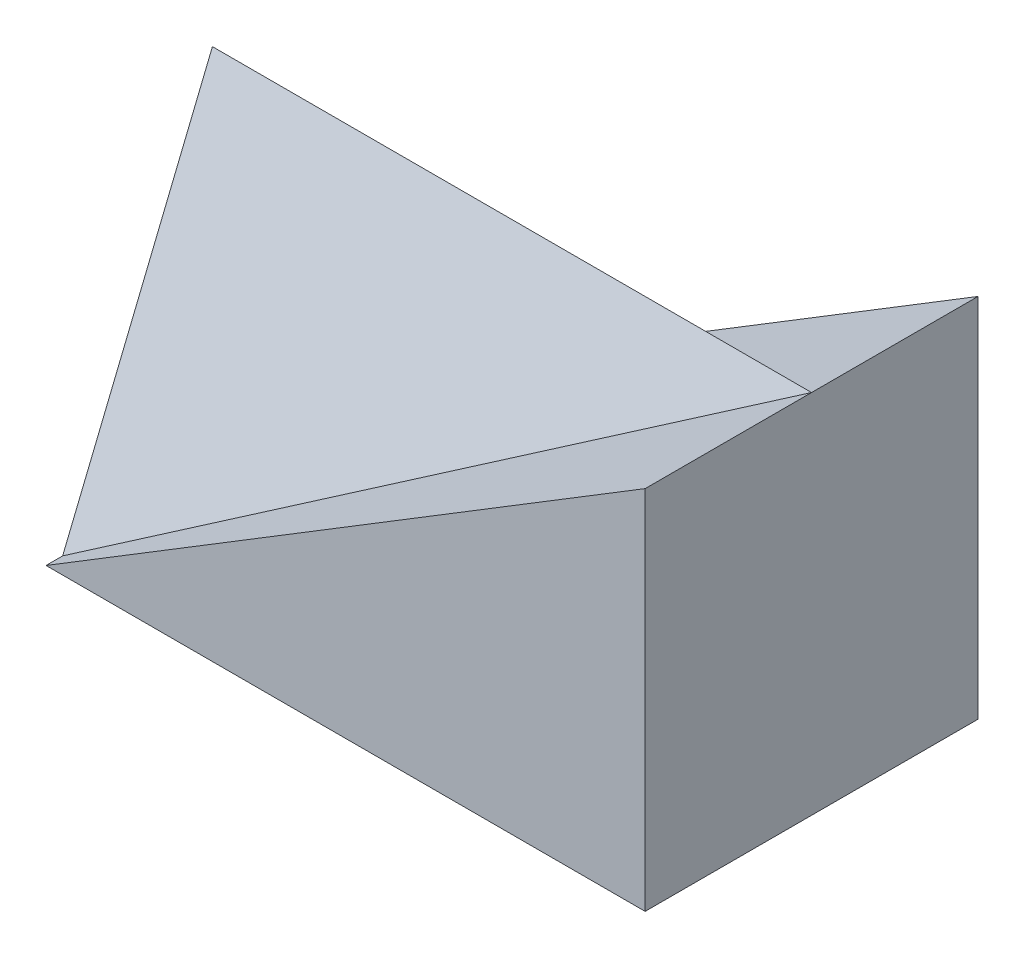
ISO-10303-21;
HEADER;
FILE_DESCRIPTION(('STEP AP214'),'2;1');
FILE_NAME('part.step','',(''),(''),'','','');
FILE_SCHEMA(('AUTOMOTIVE_DESIGN { 1 0 10303 214 1 1 1 1 }'));
ENDSEC;
DATA;
#1=APPLICATION_CONTEXT('core data for automotive mechanical design processes');
#2=APPLICATION_PROTOCOL_DEFINITION('international standard','automotive_design',2000,#1);
#3=PRODUCT_CONTEXT('',#1,'mechanical');
#4=PRODUCT('Part','Part','',(#3));
#5=PRODUCT_RELATED_PRODUCT_CATEGORY('part','',(#4));
#6=PRODUCT_DEFINITION_FORMATION('','',#4);
#7=PRODUCT_DEFINITION_CONTEXT('part definition',#1,'design');
#8=PRODUCT_DEFINITION('design','',#6,#7);
#9=PRODUCT_DEFINITION_SHAPE('','',#8);
#10=(LENGTH_UNIT() NAMED_UNIT(*) SI_UNIT(.MILLI.,.METRE.));
#11=(NAMED_UNIT(*) PLANE_ANGLE_UNIT() SI_UNIT($,.RADIAN.));
#12=(NAMED_UNIT(*) SI_UNIT($,.STERADIAN.) SOLID_ANGLE_UNIT());
#13=UNCERTAINTY_MEASURE_WITH_UNIT(LENGTH_MEASURE(1.E-05),#10,'distance_accuracy_value','');
#14=(GEOMETRIC_REPRESENTATION_CONTEXT(3) GLOBAL_UNCERTAINTY_ASSIGNED_CONTEXT((#13)) GLOBAL_UNIT_ASSIGNED_CONTEXT((#10,
#11,#12)) REPRESENTATION_CONTEXT('',''));
#15=CARTESIAN_POINT('',(0.,0.,0.));
#16=DIRECTION('',(0.,0.,1.));
#17=DIRECTION('',(1.,0.,0.));
#18=AXIS2_PLACEMENT_3D('',#15,#16,#17);
#19=CARTESIAN_POINT('',(36000.,22000.,20000.));
#20=DIRECTION('',(0.521450009453975,-0.853281833651959,0.));
#21=DIRECTION('',(0.853281833651959,0.521450009453975,0.));
#22=AXIS2_PLACEMENT_3D('',#19,#20,#21);
#23=PLANE('',#22);
#24=DIRECTION('',(0.,0.,-1.));
#25=VECTOR('',#24,1.);
#26=CARTESIAN_POINT('',(0.,0.,20000.));
#27=LINE('',#26,#25);
#28=CARTESIAN_POINT('',(0.,0.,1000.));
#29=VERTEX_POINT('',#28);
#30=CARTESIAN_POINT('',(0.,0.,0.));
#31=VERTEX_POINT('',#30);
#32=EDGE_CURVE('E41',#29,#31,#27,.T.);
#33=ORIENTED_EDGE('',*,*,#32,.F.);
#34=DIRECTION('',(0.834505713019267,0.509975713511774,0.208626428254817));
#35=VECTOR('',#34,1.);
#36=CARTESIAN_POINT('',(37740.9994626545,23063.9441160666,10435.2498656636));
#37=LINE('',#36,#35);
#38=CARTESIAN_POINT('',(36000.,22000.,10000.));
#39=VERTEX_POINT('',#38);
#40=EDGE_CURVE('E103',#29,#39,#37,.T.);
#41=ORIENTED_EDGE('',*,*,#40,.T.);
#42=DIRECTION('',(0.,0.,-1.));
#43=VECTOR('',#42,1.);
#44=CARTESIAN_POINT('',(36000.,22000.,20000.));
#45=LINE('',#44,#43);
#46=CARTESIAN_POINT('',(36000.,22000.,0.));
#47=VERTEX_POINT('',#46);
#48=EDGE_CURVE('E75',#39,#47,#45,.T.);
#49=ORIENTED_EDGE('',*,*,#48,.T.);
#50=DIRECTION('',(-0.853281833651959,-0.521450009453975,0.));
#51=VECTOR('',#50,1.);
#52=CARTESIAN_POINT('',(36000.,22000.,0.));
#53=LINE('',#52,#51);
#54=EDGE_CURVE('E110',#47,#31,#53,.T.);
#55=ORIENTED_EDGE('',*,*,#54,.T.);
#56=EDGE_LOOP('',(#33,#41,#49,#55));
#57=FACE_BOUND('',#56,.T.);
#58=ADVANCED_FACE('F33',(#57),#23,.F.);
#59=CARTESIAN_POINT('',(36000.,22000.,20000.));
#60=VERTEX_POINT('',#59);
#61=EDGE_CURVE('E121',#60,#39,#45,.T.);
#62=ORIENTED_EDGE('',*,*,#61,.T.);
#63=DIRECTION('',(-0.834505713019267,-0.509975713511774,0.208626428254817));
#64=VECTOR('',#63,1.);
#65=CARTESIAN_POINT('',(34259.0005373455,20936.0558839334,10435.2498656636));
#66=LINE('',#65,#64);
#67=CARTESIAN_POINT('',(0.,0.,19000.));
#68=VERTEX_POINT('',#67);
#69=EDGE_CURVE('E95',#39,#68,#66,.T.);
#70=ORIENTED_EDGE('',*,*,#69,.T.);
#71=CARTESIAN_POINT('',(0.,0.,20000.));
#72=VERTEX_POINT('',#71);
#73=EDGE_CURVE('E11',#72,#68,#27,.T.);
#74=ORIENTED_EDGE('',*,*,#73,.F.);
#75=DIRECTION('',(-0.853281833651959,-0.521450009453975,0.));
#76=VECTOR('',#75,1.);
#77=CARTESIAN_POINT('',(36000.,22000.,20000.));
#78=LINE('',#77,#76);
#79=EDGE_CURVE('E111',#60,#72,#78,.T.);
#80=ORIENTED_EDGE('',*,*,#79,.F.);
#81=EDGE_LOOP('',(#62,#70,#74,#80));
#82=FACE_BOUND('',#81,.T.);
#83=ADVANCED_FACE('F35',(#82),#23,.F.);
#84=CARTESIAN_POINT('',(0.,0.,20000.));
#85=DIRECTION('',(0.,1.,0.));
#86=DIRECTION('',(0.,0.,1.));
#87=AXIS2_PLACEMENT_3D('',#84,#85,#86);
#88=PLANE('',#87);
#89=ORIENTED_EDGE('',*,*,#73,.T.);
#90=DIRECTION('',(0.,0.,-1.));
#91=VECTOR('',#90,1.);
#92=CARTESIAN_POINT('',(0.,0.,19000.));
#93=LINE('',#92,#91);
#94=EDGE_CURVE('E97',#68,#29,#93,.T.);
#95=ORIENTED_EDGE('',*,*,#94,.T.);
#96=ORIENTED_EDGE('',*,*,#32,.T.);
#97=DIRECTION('',(1.,0.,0.));
#98=VECTOR('',#97,1.);
#99=CARTESIAN_POINT('',(0.,0.,0.));
#100=LINE('',#99,#98);
#101=CARTESIAN_POINT('',(36000.,0.,0.));
#102=VERTEX_POINT('',#101);
#103=EDGE_CURVE('E117',#31,#102,#100,.T.);
#104=ORIENTED_EDGE('',*,*,#103,.T.);
#105=DIRECTION('',(0.,0.,-1.));
#106=VECTOR('',#105,1.);
#107=CARTESIAN_POINT('',(36000.,0.,20000.));
#108=LINE('',#107,#106);
#109=CARTESIAN_POINT('',(36000.,0.,20000.));
#110=VERTEX_POINT('',#109);
#111=EDGE_CURVE('E123',#110,#102,#108,.T.);
#112=ORIENTED_EDGE('',*,*,#111,.F.);
#113=DIRECTION('',(1.,0.,0.));
#114=VECTOR('',#113,1.);
#115=CARTESIAN_POINT('',(0.,0.,20000.));
#116=LINE('',#115,#114);
#117=EDGE_CURVE('E80',#72,#110,#116,.T.);
#118=ORIENTED_EDGE('',*,*,#117,.F.);
#119=EDGE_LOOP('',(#89,#95,#96,#104,#112,#118));
#120=FACE_BOUND('',#119,.T.);
#121=ADVANCED_FACE('F126',(#120),#88,.F.);
#122=CARTESIAN_POINT('',(36000.,0.,20000.));
#123=DIRECTION('',(-1.,0.,0.));
#124=DIRECTION('',(0.,0.,1.));
#125=AXIS2_PLACEMENT_3D('',#122,#123,#124);
#126=PLANE('',#125);
#127=ORIENTED_EDGE('',*,*,#111,.T.);
#128=DIRECTION('',(0.,1.,0.));
#129=VECTOR('',#128,1.);
#130=CARTESIAN_POINT('',(36000.,0.,0.));
#131=LINE('',#130,#129);
#132=EDGE_CURVE('E113',#102,#47,#131,.T.);
#133=ORIENTED_EDGE('',*,*,#132,.T.);
#134=ORIENTED_EDGE('',*,*,#48,.F.);
#135=ORIENTED_EDGE('',*,*,#61,.F.);
#136=DIRECTION('',(0.,1.,0.));
#137=VECTOR('',#136,1.);
#138=CARTESIAN_POINT('',(36000.,0.,20000.));
#139=LINE('',#138,#137);
#140=EDGE_CURVE('E57',#110,#60,#139,.T.);
#141=ORIENTED_EDGE('',*,*,#140,.F.);
#142=EDGE_LOOP('',(#127,#133,#134,#135,#141));
#143=FACE_BOUND('',#142,.T.);
#144=ADVANCED_FACE('F139',(#143),#126,.F.);
#145=CARTESIAN_POINT('',(0.,0.,20000.));
#146=DIRECTION('',(0.,0.,-1.));
#147=DIRECTION('',(-1.,0.,0.));
#148=AXIS2_PLACEMENT_3D('',#145,#146,#147);
#149=PLANE('',#148);
#150=ORIENTED_EDGE('',*,*,#79,.T.);
#151=ORIENTED_EDGE('',*,*,#117,.T.);
#152=ORIENTED_EDGE('',*,*,#140,.T.);
#153=EDGE_LOOP('',(#150,#151,#152));
#154=FACE_BOUND('',#153,.T.);
#155=ADVANCED_FACE('F143',(#154),#149,.F.);
#156=CARTESIAN_POINT('',(0.,0.,0.));
#157=DIRECTION('',(0.,0.,-1.));
#158=DIRECTION('',(-1.,0.,0.));
#159=AXIS2_PLACEMENT_3D('',#156,#157,#158);
#160=PLANE('',#159);
#161=ORIENTED_EDGE('',*,*,#54,.F.);
#162=ORIENTED_EDGE('',*,*,#132,.F.);
#163=ORIENTED_EDGE('',*,*,#103,.F.);
#164=EDGE_LOOP('',(#161,#162,#163));
#165=FACE_BOUND('',#164,.T.);
#166=ADVANCED_FACE('F130',(#165),#160,.T.);
#167=CARTESIAN_POINT('',(0.,0.,1000.));
#168=DIRECTION('',(0.,0.378632845720504,-0.925546956205677));
#169=DIRECTION('',(0.,0.925546956205677,0.378632845720504));
#170=AXIS2_PLACEMENT_3D('',#167,#168,#169);
#171=PLANE('',#170);
#172=ORIENTED_EDGE('',*,*,#40,.F.);
#173=DIRECTION('',(0.,0.925546956205677,0.378632845720504));
#174=VECTOR('',#173,1.);
#175=CARTESIAN_POINT('',(0.,0.,1000.));
#176=LINE('',#175,#174);
#177=CARTESIAN_POINT('',(0.,22000.,10000.));
#178=VERTEX_POINT('',#177);
#179=EDGE_CURVE('E48',#29,#178,#176,.T.);
#180=ORIENTED_EDGE('',*,*,#179,.T.);
#181=DIRECTION('',(1.,0.,0.));
#182=VECTOR('',#181,1.);
#183=CARTESIAN_POINT('',(0.,22000.,10000.));
#184=LINE('',#183,#182);
#185=EDGE_CURVE('E91',#178,#39,#184,.T.);
#186=ORIENTED_EDGE('',*,*,#185,.T.);
#187=EDGE_LOOP('',(#172,#180,#186));
#188=FACE_BOUND('',#187,.T.);
#189=ADVANCED_FACE('F102',(#188),#171,.T.);
#190=CARTESIAN_POINT('',(0.,22000.,10000.));
#191=DIRECTION('',(0.,0.378632845720504,0.925546956205677));
#192=DIRECTION('',(0.,-0.925546956205677,0.378632845720504));
#193=AXIS2_PLACEMENT_3D('',#190,#191,#192);
#194=PLANE('',#193);
#195=ORIENTED_EDGE('',*,*,#69,.F.);
#196=ORIENTED_EDGE('',*,*,#185,.F.);
#197=DIRECTION('',(0.,-0.925546956205677,0.378632845720504));
#198=VECTOR('',#197,1.);
#199=CARTESIAN_POINT('',(0.,22000.,10000.));
#200=LINE('',#199,#198);
#201=EDGE_CURVE('E93',#178,#68,#200,.T.);
#202=ORIENTED_EDGE('',*,*,#201,.T.);
#203=EDGE_LOOP('',(#195,#196,#202));
#204=FACE_BOUND('',#203,.T.);
#205=ADVANCED_FACE('F92',(#204),#194,.T.);
#206=CARTESIAN_POINT('',(-1.4210854715202E-11,0.,0.));
#207=DIRECTION('',(-1.,0.,0.));
#208=DIRECTION('',(0.,0.,1.));
#209=AXIS2_PLACEMENT_3D('',#206,#207,#208);
#210=PLANE('',#209);
#211=ORIENTED_EDGE('',*,*,#179,.F.);
#212=ORIENTED_EDGE('',*,*,#94,.F.);
#213=ORIENTED_EDGE('',*,*,#201,.F.);
#214=EDGE_LOOP('',(#211,#212,#213));
#215=FACE_BOUND('',#214,.T.);
#216=ADVANCED_FACE('F99',(#215),#210,.T.);
#217=CLOSED_SHELL('',(#58,#83,#121,#144,#155,#166,#189,#205,#216));
#218=MANIFOLD_SOLID_BREP('B2',#217);
#219=ADVANCED_BREP_SHAPE_REPRESENTATION('',(#18,#218),#14);
#220=SHAPE_DEFINITION_REPRESENTATION(#9,#219);
ENDSEC;
END-ISO-10303-21;
